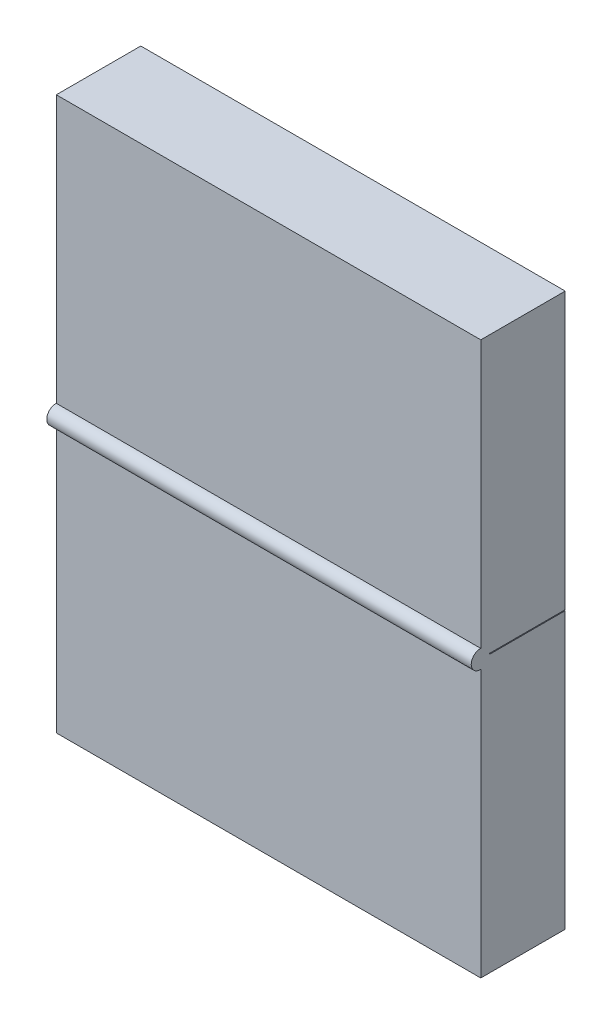
ISO-10303-21;
HEADER;
FILE_DESCRIPTION(('STEP AP214'),'2;1');
FILE_NAME('part.step','',(''),(''),'','','');
FILE_SCHEMA(('AUTOMOTIVE_DESIGN { 1 0 10303 214 1 1 1 1 }'));
ENDSEC;
DATA;
#1=APPLICATION_CONTEXT('core data for automotive mechanical design processes');
#2=APPLICATION_PROTOCOL_DEFINITION('international standard','automotive_design',2000,#1);
#3=PRODUCT_CONTEXT('',#1,'mechanical');
#4=PRODUCT('Part','Part','',(#3));
#5=PRODUCT_RELATED_PRODUCT_CATEGORY('part','',(#4));
#6=PRODUCT_DEFINITION_FORMATION('','',#4);
#7=PRODUCT_DEFINITION_CONTEXT('part definition',#1,'design');
#8=PRODUCT_DEFINITION('design','',#6,#7);
#9=PRODUCT_DEFINITION_SHAPE('','',#8);
#10=(LENGTH_UNIT() NAMED_UNIT(*) SI_UNIT(.MILLI.,.METRE.));
#11=(NAMED_UNIT(*) PLANE_ANGLE_UNIT() SI_UNIT($,.RADIAN.));
#12=(NAMED_UNIT(*) SI_UNIT($,.STERADIAN.) SOLID_ANGLE_UNIT());
#13=UNCERTAINTY_MEASURE_WITH_UNIT(LENGTH_MEASURE(1.E-05),#10,'distance_accuracy_value','');
#14=(GEOMETRIC_REPRESENTATION_CONTEXT(3) GLOBAL_UNCERTAINTY_ASSIGNED_CONTEXT((#13)) GLOBAL_UNIT_ASSIGNED_CONTEXT((#10,
#11,#12)) REPRESENTATION_CONTEXT('',''));
#15=CARTESIAN_POINT('',(0.,0.,0.));
#16=DIRECTION('',(0.,0.,1.));
#17=DIRECTION('',(1.,0.,0.));
#18=AXIS2_PLACEMENT_3D('',#15,#16,#17);
#19=CARTESIAN_POINT('',(-50.,0.,0.));
#20=DIRECTION('',(1.,0.,0.));
#21=DIRECTION('',(0.,0.,-1.));
#22=AXIS2_PLACEMENT_3D('',#19,#20,#21);
#23=PLANE('',#22);
#24=DIRECTION('',(0.,-1.,0.));
#25=VECTOR('',#24,1.);
#26=CARTESIAN_POINT('',(-50.,0.,-0.100000000000002));
#27=LINE('',#26,#25);
#28=CARTESIAN_POINT('',(-50.,65.1,-0.1));
#29=VERTEX_POINT('',#28);
#30=CARTESIAN_POINT('',(-50.,2.14767315949145,-0.100000000000002));
#31=VERTEX_POINT('',#30);
#32=EDGE_CURVE('E207',#29,#31,#27,.T.);
#33=ORIENTED_EDGE('',*,*,#32,.F.);
#34=DIRECTION('',(0.,0.,1.));
#35=VECTOR('',#34,1.);
#36=CARTESIAN_POINT('',(-50.,65.1,0.));
#37=LINE('',#36,#35);
#38=CARTESIAN_POINT('',(-50.,65.1,-20.));
#39=VERTEX_POINT('',#38);
#40=EDGE_CURVE('E362',#39,#29,#37,.T.);
#41=ORIENTED_EDGE('',*,*,#40,.F.);
#42=DIRECTION('',(0.,1.,0.));
#43=VECTOR('',#42,1.);
#44=CARTESIAN_POINT('',(-50.,0.,-20.));
#45=LINE('',#44,#43);
#46=CARTESIAN_POINT('',(-50.,0.1,-20.));
#47=VERTEX_POINT('',#46);
#48=EDGE_CURVE('E369',#47,#39,#45,.T.);
#49=ORIENTED_EDGE('',*,*,#48,.F.);
#50=DIRECTION('',(0.,0.,-1.));
#51=VECTOR('',#50,1.);
#52=CARTESIAN_POINT('',(-50.,0.1,0.));
#53=LINE('',#52,#51);
#54=CARTESIAN_POINT('',(-50.,0.1,-2.14767315949145));
#55=VERTEX_POINT('',#54);
#56=EDGE_CURVE('E191',#55,#47,#53,.T.);
#57=ORIENTED_EDGE('',*,*,#56,.F.);
#58=CARTESIAN_POINT('',(-50.,0.,0.));
#59=DIRECTION('',(1.,0.,0.));
#60=DIRECTION('',(0.,0.,-1.));
#61=AXIS2_PLACEMENT_3D('',#58,#59,#60);
#62=CIRCLE('',#61,2.15);
#63=CARTESIAN_POINT('',(-50.,-0.1,-2.14767315949145));
#64=VERTEX_POINT('',#63);
#65=EDGE_CURVE('E179',#64,#55,#62,.T.);
#66=ORIENTED_EDGE('',*,*,#65,.F.);
#67=DIRECTION('',(0.,0.,-1.));
#68=VECTOR('',#67,1.);
#69=CARTESIAN_POINT('',(-50.,-0.1,0.));
#70=LINE('',#69,#68);
#71=CARTESIAN_POINT('',(-50.,-0.1,-20.));
#72=VERTEX_POINT('',#71);
#73=EDGE_CURVE('E189',#64,#72,#70,.T.);
#74=ORIENTED_EDGE('',*,*,#73,.T.);
#75=DIRECTION('',(0.,-1.,0.));
#76=VECTOR('',#75,1.);
#77=CARTESIAN_POINT('',(-50.,0.,-20.));
#78=LINE('',#77,#76);
#79=CARTESIAN_POINT('',(-50.,-65.1,-20.));
#80=VERTEX_POINT('',#79);
#81=EDGE_CURVE('E193',#72,#80,#78,.T.);
#82=ORIENTED_EDGE('',*,*,#81,.T.);
#83=DIRECTION('',(0.,0.,1.));
#84=VECTOR('',#83,1.);
#85=CARTESIAN_POINT('',(-50.,-65.1,0.));
#86=LINE('',#85,#84);
#87=CARTESIAN_POINT('',(-50.,-65.1,-0.1));
#88=VERTEX_POINT('',#87);
#89=EDGE_CURVE('E200',#80,#88,#86,.T.);
#90=ORIENTED_EDGE('',*,*,#89,.T.);
#91=DIRECTION('',(0.,1.,0.));
#92=VECTOR('',#91,1.);
#93=CARTESIAN_POINT('',(-50.,0.,-0.100000000000002));
#94=LINE('',#93,#92);
#95=CARTESIAN_POINT('',(-50.,-2.14767315949145,-0.100000000000002));
#96=VERTEX_POINT('',#95);
#97=EDGE_CURVE('E215',#88,#96,#94,.T.);
#98=ORIENTED_EDGE('',*,*,#97,.T.);
#99=EDGE_CURVE('E104',#31,#96,#62,.T.);
#100=ORIENTED_EDGE('',*,*,#99,.F.);
#101=EDGE_LOOP('',(#33,#41,#49,#57,#66,#74,#82,#90,#98,#100));
#102=FACE_BOUND('',#101,.T.);
#103=ADVANCED_FACE('F101',(#102),#23,.F.);
#104=CARTESIAN_POINT('',(50.,0.1,0.));
#105=DIRECTION('',(0.,1.,0.));
#106=DIRECTION('',(0.,0.,1.));
#107=AXIS2_PLACEMENT_3D('',#104,#105,#106);
#108=PLANE('',#107);
#109=ORIENTED_EDGE('',*,*,#56,.T.);
#110=DIRECTION('',(-1.,0.,0.));
#111=VECTOR('',#110,1.);
#112=CARTESIAN_POINT('',(50.,0.1,-20.));
#113=LINE('',#112,#111);
#114=CARTESIAN_POINT('',(50.,0.1,-20.));
#115=VERTEX_POINT('',#114);
#116=EDGE_CURVE('E377',#115,#47,#113,.T.);
#117=ORIENTED_EDGE('',*,*,#116,.F.);
#118=DIRECTION('',(0.,0.,-1.));
#119=VECTOR('',#118,1.);
#120=CARTESIAN_POINT('',(50.,0.1,0.));
#121=LINE('',#120,#119);
#122=CARTESIAN_POINT('',(50.,0.1,-2.14767315949145));
#123=VERTEX_POINT('',#122);
#124=EDGE_CURVE('E382',#123,#115,#121,.T.);
#125=ORIENTED_EDGE('',*,*,#124,.F.);
#126=DIRECTION('',(-1.,0.,0.));
#127=VECTOR('',#126,1.);
#128=CARTESIAN_POINT('',(50.,0.1,-2.14767315949145));
#129=LINE('',#128,#127);
#130=EDGE_CURVE('E112',#123,#55,#129,.T.);
#131=ORIENTED_EDGE('',*,*,#130,.T.);
#132=EDGE_LOOP('',(#109,#117,#125,#131));
#133=FACE_BOUND('',#132,.T.);
#134=ADVANCED_FACE('F257',(#133),#108,.F.);
#135=CARTESIAN_POINT('',(50.,0.,-20.));
#136=DIRECTION('',(0.,0.,1.));
#137=DIRECTION('',(1.,0.,0.));
#138=AXIS2_PLACEMENT_3D('',#135,#136,#137);
#139=PLANE('',#138);
#140=ORIENTED_EDGE('',*,*,#48,.T.);
#141=DIRECTION('',(-1.,0.,0.));
#142=VECTOR('',#141,1.);
#143=CARTESIAN_POINT('',(50.,65.1,-20.));
#144=LINE('',#143,#142);
#145=CARTESIAN_POINT('',(50.,65.1,-20.));
#146=VERTEX_POINT('',#145);
#147=EDGE_CURVE('E370',#146,#39,#144,.T.);
#148=ORIENTED_EDGE('',*,*,#147,.F.);
#149=DIRECTION('',(0.,1.,0.));
#150=VECTOR('',#149,1.);
#151=CARTESIAN_POINT('',(50.,0.,-20.));
#152=LINE('',#151,#150);
#153=EDGE_CURVE('E390',#115,#146,#152,.T.);
#154=ORIENTED_EDGE('',*,*,#153,.F.);
#155=ORIENTED_EDGE('',*,*,#116,.T.);
#156=EDGE_LOOP('',(#140,#148,#154,#155));
#157=FACE_BOUND('',#156,.T.);
#158=ADVANCED_FACE('F263',(#157),#139,.F.);
#159=CARTESIAN_POINT('',(50.,65.1,0.));
#160=DIRECTION('',(0.,-1.,0.));
#161=DIRECTION('',(0.,0.,-1.));
#162=AXIS2_PLACEMENT_3D('',#159,#160,#161);
#163=PLANE('',#162);
#164=ORIENTED_EDGE('',*,*,#40,.T.);
#165=DIRECTION('',(-1.,0.,0.));
#166=VECTOR('',#165,1.);
#167=CARTESIAN_POINT('',(50.,65.1,-0.1));
#168=LINE('',#167,#166);
#169=CARTESIAN_POINT('',(50.,65.1,-0.1));
#170=VERTEX_POINT('',#169);
#171=EDGE_CURVE('E365',#170,#29,#168,.T.);
#172=ORIENTED_EDGE('',*,*,#171,.F.);
#173=DIRECTION('',(0.,0.,1.));
#174=VECTOR('',#173,1.);
#175=CARTESIAN_POINT('',(50.,65.1,0.));
#176=LINE('',#175,#174);
#177=EDGE_CURVE('E117',#146,#170,#176,.T.);
#178=ORIENTED_EDGE('',*,*,#177,.F.);
#179=ORIENTED_EDGE('',*,*,#147,.T.);
#180=EDGE_LOOP('',(#164,#172,#178,#179));
#181=FACE_BOUND('',#180,.T.);
#182=ADVANCED_FACE('F256',(#181),#163,.F.);
#183=CARTESIAN_POINT('',(50.,0.,-0.100000000000002));
#184=DIRECTION('',(0.,0.,-1.));
#185=DIRECTION('',(0.,1.,0.));
#186=AXIS2_PLACEMENT_3D('',#183,#184,#185);
#187=PLANE('',#186);
#188=ORIENTED_EDGE('',*,*,#32,.T.);
#189=DIRECTION('',(-1.,0.,0.));
#190=VECTOR('',#189,1.);
#191=CARTESIAN_POINT('',(50.,2.14767315949145,-0.100000000000002));
#192=LINE('',#191,#190);
#193=CARTESIAN_POINT('',(50.,2.14767315949145,-0.100000000000002));
#194=VERTEX_POINT('',#193);
#195=EDGE_CURVE('E12',#194,#31,#192,.T.);
#196=ORIENTED_EDGE('',*,*,#195,.F.);
#197=DIRECTION('',(0.,-1.,0.));
#198=VECTOR('',#197,1.);
#199=CARTESIAN_POINT('',(50.,0.,-0.100000000000002));
#200=LINE('',#199,#198);
#201=EDGE_CURVE('E366',#170,#194,#200,.T.);
#202=ORIENTED_EDGE('',*,*,#201,.F.);
#203=ORIENTED_EDGE('',*,*,#171,.T.);
#204=EDGE_LOOP('',(#188,#196,#202,#203));
#205=FACE_BOUND('',#204,.T.);
#206=ADVANCED_FACE('F254',(#205),#187,.F.);
#207=CARTESIAN_POINT('',(50.,0.,0.));
#208=DIRECTION('',(1.,0.,0.));
#209=DIRECTION('',(0.,0.,-1.));
#210=AXIS2_PLACEMENT_3D('',#207,#208,#209);
#211=PLANE('',#210);
#212=ORIENTED_EDGE('',*,*,#201,.T.);
#213=CARTESIAN_POINT('',(50.,0.,0.));
#214=DIRECTION('',(1.,0.,0.));
#215=DIRECTION('',(0.,0.,-1.));
#216=AXIS2_PLACEMENT_3D('',#213,#214,#215);
#217=CIRCLE('',#216,2.15);
#218=CARTESIAN_POINT('',(50.,-2.14767315949145,-0.100000000000002));
#219=VERTEX_POINT('',#218);
#220=EDGE_CURVE('E209',#194,#219,#217,.T.);
#221=ORIENTED_EDGE('',*,*,#220,.T.);
#222=DIRECTION('',(0.,1.,0.));
#223=VECTOR('',#222,1.);
#224=CARTESIAN_POINT('',(50.,0.,-0.100000000000002));
#225=LINE('',#224,#223);
#226=CARTESIAN_POINT('',(50.,-65.1,-0.1));
#227=VERTEX_POINT('',#226);
#228=EDGE_CURVE('E194',#227,#219,#225,.T.);
#229=ORIENTED_EDGE('',*,*,#228,.F.);
#230=DIRECTION('',(0.,0.,1.));
#231=VECTOR('',#230,1.);
#232=CARTESIAN_POINT('',(50.,-65.1,0.));
#233=LINE('',#232,#231);
#234=CARTESIAN_POINT('',(50.,-65.1,-20.));
#235=VERTEX_POINT('',#234);
#236=EDGE_CURVE('E197',#235,#227,#233,.T.);
#237=ORIENTED_EDGE('',*,*,#236,.F.);
#238=DIRECTION('',(0.,-1.,0.));
#239=VECTOR('',#238,1.);
#240=CARTESIAN_POINT('',(50.,0.,-20.));
#241=LINE('',#240,#239);
#242=CARTESIAN_POINT('',(50.,-0.1,-20.));
#243=VERTEX_POINT('',#242);
#244=EDGE_CURVE('E236',#243,#235,#241,.T.);
#245=ORIENTED_EDGE('',*,*,#244,.F.);
#246=DIRECTION('',(0.,0.,-1.));
#247=VECTOR('',#246,1.);
#248=CARTESIAN_POINT('',(50.,-0.1,0.));
#249=LINE('',#248,#247);
#250=CARTESIAN_POINT('',(50.,-0.1,-2.14767315949145));
#251=VERTEX_POINT('',#250);
#252=EDGE_CURVE('E181',#251,#243,#249,.T.);
#253=ORIENTED_EDGE('',*,*,#252,.F.);
#254=EDGE_CURVE('E182',#251,#123,#217,.T.);
#255=ORIENTED_EDGE('',*,*,#254,.T.);
#256=ORIENTED_EDGE('',*,*,#124,.T.);
#257=ORIENTED_EDGE('',*,*,#153,.T.);
#258=ORIENTED_EDGE('',*,*,#177,.T.);
#259=EDGE_LOOP('',(#212,#221,#229,#237,#245,#253,#255,#256,#257,#258));
#260=FACE_BOUND('',#259,.T.);
#261=ADVANCED_FACE('F234',(#260),#211,.T.);
#262=CARTESIAN_POINT('',(50.,-65.1,0.));
#263=DIRECTION('',(0.,-1.,0.));
#264=DIRECTION('',(0.,0.,-1.));
#265=AXIS2_PLACEMENT_3D('',#262,#263,#264);
#266=PLANE('',#265);
#267=ORIENTED_EDGE('',*,*,#89,.F.);
#268=DIRECTION('',(-1.,0.,0.));
#269=VECTOR('',#268,1.);
#270=CARTESIAN_POINT('',(50.,-65.1,-20.));
#271=LINE('',#270,#269);
#272=EDGE_CURVE('E204',#235,#80,#271,.T.);
#273=ORIENTED_EDGE('',*,*,#272,.F.);
#274=ORIENTED_EDGE('',*,*,#236,.T.);
#275=DIRECTION('',(-1.,0.,0.));
#276=VECTOR('',#275,1.);
#277=CARTESIAN_POINT('',(50.,-65.1,-0.1));
#278=LINE('',#277,#276);
#279=EDGE_CURVE('E206',#227,#88,#278,.T.);
#280=ORIENTED_EDGE('',*,*,#279,.T.);
#281=EDGE_LOOP('',(#267,#273,#274,#280));
#282=FACE_BOUND('',#281,.T.);
#283=ADVANCED_FACE('F240',(#282),#266,.T.);
#284=CARTESIAN_POINT('',(50.,0.,-20.));
#285=DIRECTION('',(0.,0.,-1.));
#286=DIRECTION('',(-1.,0.,0.));
#287=AXIS2_PLACEMENT_3D('',#284,#285,#286);
#288=PLANE('',#287);
#289=ORIENTED_EDGE('',*,*,#81,.F.);
#290=DIRECTION('',(-1.,0.,0.));
#291=VECTOR('',#290,1.);
#292=CARTESIAN_POINT('',(50.,-0.1,-20.));
#293=LINE('',#292,#291);
#294=EDGE_CURVE('E166',#243,#72,#293,.T.);
#295=ORIENTED_EDGE('',*,*,#294,.F.);
#296=ORIENTED_EDGE('',*,*,#244,.T.);
#297=ORIENTED_EDGE('',*,*,#272,.T.);
#298=EDGE_LOOP('',(#289,#295,#296,#297));
#299=FACE_BOUND('',#298,.T.);
#300=ADVANCED_FACE('F241',(#299),#288,.T.);
#301=CARTESIAN_POINT('',(50.,0.,-0.100000000000002));
#302=DIRECTION('',(0.,0.,1.));
#303=DIRECTION('',(0.,-1.,0.));
#304=AXIS2_PLACEMENT_3D('',#301,#302,#303);
#305=PLANE('',#304);
#306=ORIENTED_EDGE('',*,*,#97,.F.);
#307=ORIENTED_EDGE('',*,*,#279,.F.);
#308=ORIENTED_EDGE('',*,*,#228,.T.);
#309=DIRECTION('',(-1.,0.,0.));
#310=VECTOR('',#309,1.);
#311=CARTESIAN_POINT('',(50.,-2.14767315949145,-0.100000000000002));
#312=LINE('',#311,#310);
#313=EDGE_CURVE('E208',#219,#96,#312,.T.);
#314=ORIENTED_EDGE('',*,*,#313,.T.);
#315=EDGE_LOOP('',(#306,#307,#308,#314));
#316=FACE_BOUND('',#315,.T.);
#317=ADVANCED_FACE('F227',(#316),#305,.T.);
#318=CARTESIAN_POINT('',(50.,-0.1,0.));
#319=DIRECTION('',(0.,1.,0.));
#320=DIRECTION('',(0.,0.,1.));
#321=AXIS2_PLACEMENT_3D('',#318,#319,#320);
#322=PLANE('',#321);
#323=ORIENTED_EDGE('',*,*,#73,.F.);
#324=DIRECTION('',(-1.,0.,0.));
#325=VECTOR('',#324,1.);
#326=CARTESIAN_POINT('',(50.,-0.1,-2.14767315949145));
#327=LINE('',#326,#325);
#328=EDGE_CURVE('E172',#251,#64,#327,.T.);
#329=ORIENTED_EDGE('',*,*,#328,.F.);
#330=ORIENTED_EDGE('',*,*,#252,.T.);
#331=ORIENTED_EDGE('',*,*,#294,.T.);
#332=EDGE_LOOP('',(#323,#329,#330,#331));
#333=FACE_BOUND('',#332,.T.);
#334=ADVANCED_FACE('F192',(#333),#322,.T.);
#335=CARTESIAN_POINT('',(50.,0.,0.));
#336=DIRECTION('',(-1.,0.,0.));
#337=DIRECTION('',(0.,0.,1.));
#338=AXIS2_PLACEMENT_3D('',#335,#336,#337);
#339=CYLINDRICAL_SURFACE('',#338,2.15);
#340=ORIENTED_EDGE('',*,*,#328,.T.);
#341=ORIENTED_EDGE('',*,*,#65,.T.);
#342=ORIENTED_EDGE('',*,*,#130,.F.);
#343=ORIENTED_EDGE('',*,*,#254,.F.);
#344=EDGE_LOOP('',(#340,#341,#342,#343));
#345=FACE_BOUND('',#344,.T.);
#346=ADVANCED_FACE('F103',(#345),#339,.T.);
#347=ORIENTED_EDGE('',*,*,#313,.F.);
#348=ORIENTED_EDGE('',*,*,#220,.F.);
#349=ORIENTED_EDGE('',*,*,#195,.T.);
#350=ORIENTED_EDGE('',*,*,#99,.T.);
#351=EDGE_LOOP('',(#347,#348,#349,#350));
#352=FACE_BOUND('',#351,.T.);
#353=ADVANCED_FACE('F224',(#352),#339,.T.);
#354=CLOSED_SHELL('',(#103,#134,#158,#182,#206,#261,#283,#300,#317,#334,#346,#353));
#355=MANIFOLD_SOLID_BREP('B2',#354);
#356=ADVANCED_BREP_SHAPE_REPRESENTATION('',(#18,#355),#14);
#357=SHAPE_DEFINITION_REPRESENTATION(#9,#356);
ENDSEC;
END-ISO-10303-21;
